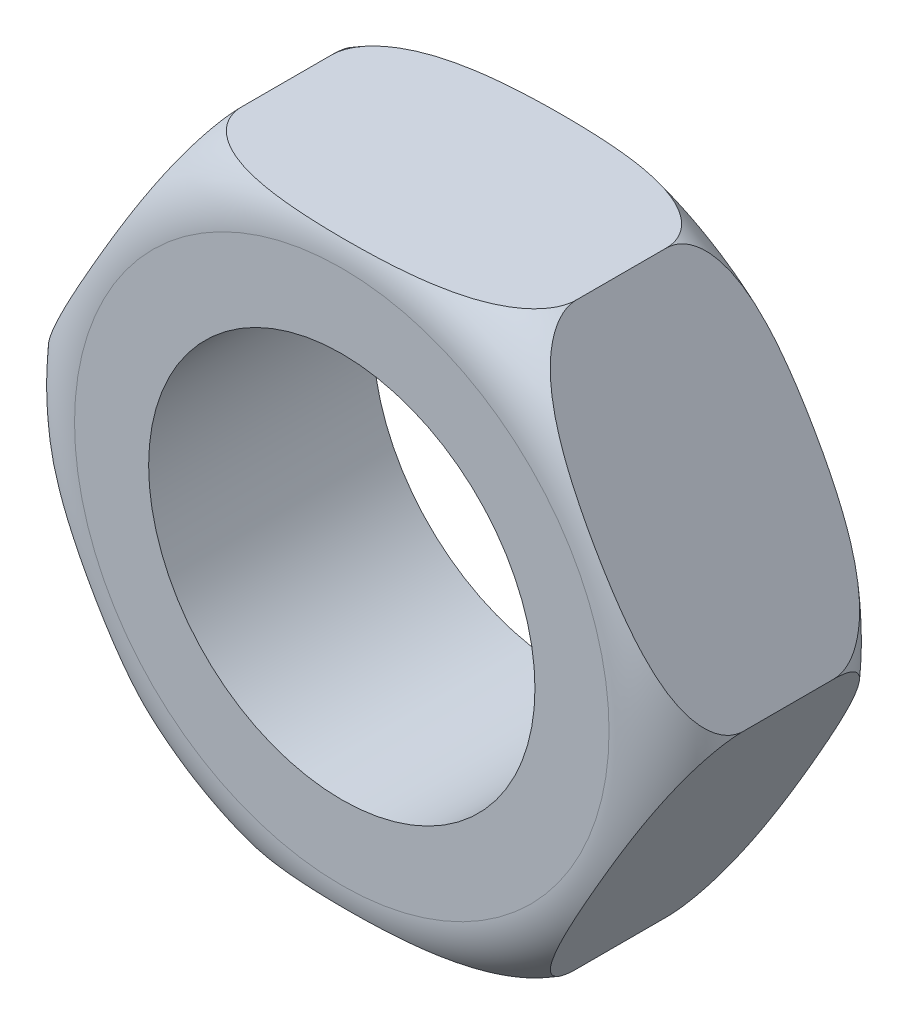
ISO-10303-21;
HEADER;
FILE_DESCRIPTION(('STEP AP214'),'2;1');
FILE_NAME('part.step','',(''),(''),'','','');
FILE_SCHEMA(('AUTOMOTIVE_DESIGN { 1 0 10303 214 1 1 1 1 }'));
ENDSEC;
DATA;
#1=APPLICATION_CONTEXT('core data for automotive mechanical design processes');
#2=APPLICATION_PROTOCOL_DEFINITION('international standard','automotive_design',2000,#1);
#3=PRODUCT_CONTEXT('',#1,'mechanical');
#4=PRODUCT('Part','Part','',(#3));
#5=PRODUCT_RELATED_PRODUCT_CATEGORY('part','',(#4));
#6=PRODUCT_DEFINITION_FORMATION('','',#4);
#7=PRODUCT_DEFINITION_CONTEXT('part definition',#1,'design');
#8=PRODUCT_DEFINITION('design','',#6,#7);
#9=PRODUCT_DEFINITION_SHAPE('','',#8);
#10=(LENGTH_UNIT() NAMED_UNIT(*) SI_UNIT(.MILLI.,.METRE.));
#11=(NAMED_UNIT(*) PLANE_ANGLE_UNIT() SI_UNIT($,.RADIAN.));
#12=(NAMED_UNIT(*) SI_UNIT($,.STERADIAN.) SOLID_ANGLE_UNIT());
#13=UNCERTAINTY_MEASURE_WITH_UNIT(LENGTH_MEASURE(1.E-05),#10,'distance_accuracy_value','');
#14=(GEOMETRIC_REPRESENTATION_CONTEXT(3) GLOBAL_UNCERTAINTY_ASSIGNED_CONTEXT((#13)) GLOBAL_UNIT_ASSIGNED_CONTEXT((#10,
#11,#12)) REPRESENTATION_CONTEXT('',''));
#15=CARTESIAN_POINT('',(0.,0.,0.));
#16=DIRECTION('',(0.,0.,1.));
#17=DIRECTION('',(1.,0.,0.));
#18=AXIS2_PLACEMENT_3D('',#15,#16,#17);
#19=CARTESIAN_POINT('',(-6.87407664253898,-11.90625,-90.2989));
#20=DIRECTION('',(0.,1.,0.));
#21=DIRECTION('',(1.,0.,0.));
#22=AXIS2_PLACEMENT_3D('',#19,#20,#21);
#23=PLANE('',#22);
#24=DIRECTION('',(0.,0.,-1.));
#25=VECTOR('',#24,1.);
#26=CARTESIAN_POINT('',(6.874076642539,-11.90625,-90.2989));
#27=LINE('',#26,#25);
#28=CARTESIAN_POINT('',(6.87407664253901,-11.90625,-93.06496));
#29=VERTEX_POINT('',#28);
#30=CARTESIAN_POINT('',(6.874076642539,-11.90625,-96.75304));
#31=VERTEX_POINT('',#30);
#32=EDGE_CURVE('E90',#29,#31,#27,.T.);
#33=ORIENTED_EDGE('',*,*,#32,.F.);
#34=CARTESIAN_POINT('',(6.87407664253902,-11.90625,-93.06496));
#35=CARTESIAN_POINT('',(6.87407664253902,-11.90625,-92.5761053863462));
#36=CARTESIAN_POINT('',(6.54380387878346,-11.90625,-92.1318942755352));
#37=CARTESIAN_POINT('',(6.27092783932574,-11.90625,-91.7648807585171));
#38=CARTESIAN_POINT('',(5.79655615993552,-11.90625,-91.4704397051228));
#39=CARTESIAN_POINT('',(5.07488756456218,-11.90625,-91.0225022108432));
#40=CARTESIAN_POINT('',(3.93169877939446,-11.90625,-90.7784110832678));
#41=CARTESIAN_POINT('',(2.42435365309554,-11.90625,-90.4565661034209));
#42=CARTESIAN_POINT('',(-0.0182857169352697,-11.90625,-90.4578550277632));
#43=CARTESIAN_POINT('',(-2.4549186549817,-11.90625,-90.4591407826502));
#44=CARTESIAN_POINT('',(-3.95635400238736,-11.90625,-90.7837080217361));
#45=CARTESIAN_POINT('',(-5.0860129627235,-11.90625,-91.0279078738966));
#46=CARTESIAN_POINT('',(-5.80218815013209,-11.90625,-91.4739413587718));
#47=CARTESIAN_POINT('',(-6.27164365050244,-11.90625,-91.7663179678829));
#48=CARTESIAN_POINT('',(-6.54373366839595,-11.90625,-92.1317999062995));
#49=CARTESIAN_POINT('',(-6.87407664253898,-11.90625,-92.5755294905997));
#50=CARTESIAN_POINT('',(-6.87407664253898,-11.90625,-93.06496));
#51=B_SPLINE_CURVE_WITH_KNOTS('',2,(#34,#35,#36,#37,#38,#39,#40,#41,#42,#43,#44,#45,#46,#47,#48,
#49,#50),.UNSPECIFIED.,.F.,.F.,(3,2,2,2,2,2,2,2,3),(0.,0.0625,0.125,0.25,0.5,0.75,0.875,0.9375,
1.),.UNSPECIFIED.);
#52=CARTESIAN_POINT('',(-6.87407664253898,-11.90625,-93.06496));
#53=VERTEX_POINT('',#52);
#54=EDGE_CURVE('E255',#29,#53,#51,.T.);
#55=ORIENTED_EDGE('',*,*,#54,.T.);
#56=DIRECTION('',(0.,0.,-1.));
#57=VECTOR('',#56,1.);
#58=CARTESIAN_POINT('',(-6.87407664253898,-11.90625,-90.2989));
#59=LINE('',#58,#57);
#60=CARTESIAN_POINT('',(-6.874076642539,-11.90625,-96.75304));
#61=VERTEX_POINT('',#60);
#62=EDGE_CURVE('E11',#53,#61,#59,.T.);
#63=ORIENTED_EDGE('',*,*,#62,.T.);
#64=CARTESIAN_POINT('',(-6.87407664253901,-11.90625,-96.75304));
#65=CARTESIAN_POINT('',(-6.87407664253901,-11.90625,-97.2418946136181));
#66=CARTESIAN_POINT('',(-6.54380387878346,-11.90625,-97.6861057244648));
#67=CARTESIAN_POINT('',(-6.27092783935708,-11.90625,-98.0531192414704));
#68=CARTESIAN_POINT('',(-5.79655615993552,-11.90625,-98.3475602948772));
#69=CARTESIAN_POINT('',(-5.07488756462839,-11.90625,-98.7954977891051));
#70=CARTESIAN_POINT('',(-3.93169877939448,-11.90625,-99.0395889167322));
#71=CARTESIAN_POINT('',(-2.42435365332761,-11.90625,-99.3614338965792));
#72=CARTESIAN_POINT('',(0.0182857169351404,-11.90625,-99.3601449722368));
#73=CARTESIAN_POINT('',(2.45491865515262,-11.90625,-99.3588592173497));
#74=CARTESIAN_POINT('',(3.95635400238732,-11.90625,-99.0342919782639));
#75=CARTESIAN_POINT('',(5.08601296274402,-11.90625,-98.7900921260712));
#76=CARTESIAN_POINT('',(5.80218815013206,-11.90625,-98.3440586412283));
#77=CARTESIAN_POINT('',(6.27164365049224,-11.90625,-98.0516820321363));
#78=CARTESIAN_POINT('',(6.54373366839594,-11.90625,-97.6862000937005));
#79=CARTESIAN_POINT('',(6.874076642539,-11.90625,-97.2424705093936));
#80=CARTESIAN_POINT('',(6.874076642539,-11.90625,-96.75304));
#81=B_SPLINE_CURVE_WITH_KNOTS('',2,(#64,#65,#66,#67,#68,#69,#70,#71,#72,#73,#74,#75,#76,#77,#78,
#79,#80),.UNSPECIFIED.,.F.,.F.,(3,2,2,2,2,2,2,2,3),(0.,0.0625,0.125,0.25,0.5,0.75,0.875,0.9375,
1.),.UNSPECIFIED.);
#82=EDGE_CURVE('E403',#61,#31,#81,.T.);
#83=ORIENTED_EDGE('',*,*,#82,.T.);
#84=EDGE_LOOP('',(#33,#55,#63,#83));
#85=FACE_BOUND('',#84,.T.);
#86=ADVANCED_FACE('F17',(#85),#23,.F.);
#87=CARTESIAN_POINT('',(-13.748153285078,0.,-90.2989));
#88=DIRECTION('',(0.866025403784439,0.5,0.));
#89=DIRECTION('',(0.,0.,-1.));
#90=AXIS2_PLACEMENT_3D('',#87,#88,#89);
#91=PLANE('',#90);
#92=ORIENTED_EDGE('',*,*,#62,.F.);
#93=CARTESIAN_POINT('',(-6.87407664253898,-11.90625,-93.06496));
#94=CARTESIAN_POINT('',(-6.87407664253898,-11.90625,-92.5760058480893));
#95=CARTESIAN_POINT('',(-7.03927004143693,-11.6201266400338,-92.1317410091233));
#96=CARTESIAN_POINT('',(-7.17568813046454,-11.3838435787665,-91.7648633932002));
#97=CARTESIAN_POINT('',(-7.41276338560254,-10.9732171916501,-91.4705309181294));
#98=CARTESIAN_POINT('',(-7.77293234532155,-10.3493862541076,-91.0233757677697));
#99=CARTESIAN_POINT('',(-8.34306670156636,-9.36188458195097,-90.7793508882997));
#100=CARTESIAN_POINT('',(-9.09532815061541,-8.05892953162263,-90.4573732571968));
#101=CARTESIAN_POINT('',(-10.3146535980907,-5.9469959056338,-90.4578507959048));
#102=CARTESIAN_POINT('',(-11.5374262048112,-3.8290916246905,-90.4583296846642));
#103=CARTESIAN_POINT('',(-12.2902049825038,-2.52524053486718,-90.7841030566513));
#104=CARTESIAN_POINT('',(-12.8572751999037,-1.54304610687141,-91.029508987783));
#105=CARTESIAN_POINT('',(-13.2158049185761,-0.922054418107435,-91.4784336156656));
#106=CARTESIAN_POINT('',(-13.4498057631221,-0.516753066339889,-91.7714323172822));
#107=CARTESIAN_POINT('',(-13.5850275278136,-0.282542099605026,-92.1373185894382));
#108=CARTESIAN_POINT('',(-13.748153285078,0.,-92.5787081494267));
#109=CARTESIAN_POINT('',(-13.748153285078,0.,-93.06496));
#110=B_SPLINE_CURVE_WITH_KNOTS('',2,(#93,#94,#95,#96,#97,#98,#99,#100,#101,#102,#103,#104,#105,
#106,#107,#108,#109),.UNSPECIFIED.,.F.,.F.,(3,2,2,2,2,2,2,2,3),(0.,0.0625,0.125,0.25,0.5,0.75,
0.875,0.9375,1.),.UNSPECIFIED.);
#111=CARTESIAN_POINT('',(-13.748153285078,0.,-93.06496));
#112=VERTEX_POINT('',#111);
#113=EDGE_CURVE('E273',#53,#112,#110,.T.);
#114=ORIENTED_EDGE('',*,*,#113,.T.);
#115=DIRECTION('',(0.,0.,-1.));
#116=VECTOR('',#115,1.);
#117=CARTESIAN_POINT('',(-13.748153285078,0.,-90.2989));
#118=LINE('',#117,#116);
#119=CARTESIAN_POINT('',(-13.748153285078,0.,-96.75304));
#120=VERTEX_POINT('',#119);
#121=EDGE_CURVE('E30',#112,#120,#118,.T.);
#122=ORIENTED_EDGE('',*,*,#121,.T.);
#123=CARTESIAN_POINT('',(-13.748153285078,0.,-96.75304));
#124=CARTESIAN_POINT('',(-13.748153285078,0.,-97.2419941518704));
#125=CARTESIAN_POINT('',(-13.58295988618,-0.286123359966257,-97.6862589908768));
#126=CARTESIAN_POINT('',(-13.4465417971845,-0.522406421177844,-98.0531366067466));
#127=CARTESIAN_POINT('',(-13.2094665420144,-0.933032808349879,-98.3474690818706));
#128=CARTESIAN_POINT('',(-12.8492975823377,-1.55686374581912,-98.7946242321979));
#129=CARTESIAN_POINT('',(-12.2791632260506,-2.54436541804904,-99.0386491117003));
#130=CARTESIAN_POINT('',(-11.5269017771174,-3.8473204681766,-99.3606267427725));
#131=CARTESIAN_POINT('',(-10.3075763295263,-5.9592540943662,-99.3601492040952));
#132=CARTESIAN_POINT('',(-9.0848037228409,-8.07715837524866,-99.3596703153667));
#133=CARTESIAN_POINT('',(-8.33202494511309,-9.38100946513283,-99.0338969433487));
#134=CARTESIAN_POINT('',(-7.76495472769155,-10.3632038931661,-98.7884910121958));
#135=CARTESIAN_POINT('',(-7.40642500904078,-10.9841955818926,-98.3395663843344));
#136=CARTESIAN_POINT('',(-7.1724241644873,-11.3894969336732,-98.0465676827044));
#137=CARTESIAN_POINT('',(-7.03720239980334,-11.623707900395,-97.6806814105619));
#138=CARTESIAN_POINT('',(-6.87407664253899,-11.90625,-97.2392918505647));
#139=CARTESIAN_POINT('',(-6.87407664253899,-11.90625,-96.75304));
#140=B_SPLINE_CURVE_WITH_KNOTS('',2,(#123,#124,#125,#126,#127,#128,#129,#130,#131,#132,#133,
#134,#135,#136,#137,#138,#139),.UNSPECIFIED.,.F.,.F.,(3,2,2,2,2,2,2,2,3),(0.,0.0625,0.125,0.25,
0.5,0.75,0.875,0.9375,1.),.UNSPECIFIED.);
#141=EDGE_CURVE('E137',#120,#61,#140,.T.);
#142=ORIENTED_EDGE('',*,*,#141,.T.);
#143=EDGE_LOOP('',(#92,#114,#122,#142));
#144=FACE_BOUND('',#143,.T.);
#145=ADVANCED_FACE('F318',(#144),#91,.F.);
#146=CARTESIAN_POINT('',(-6.87407664253898,11.90625,-90.2989));
#147=DIRECTION('',(0.866025403784439,-0.5,0.));
#148=DIRECTION('',(0.,0.,-1.));
#149=AXIS2_PLACEMENT_3D('',#146,#147,#148);
#150=PLANE('',#149);
#151=ORIENTED_EDGE('',*,*,#121,.F.);
#152=CARTESIAN_POINT('',(-13.748153285078,0.,-93.06496));
#153=CARTESIAN_POINT('',(-13.748153285078,0.,-92.5760058481065));
#154=CARTESIAN_POINT('',(-13.58295988618,0.286123359966259,-92.1317410091233));
#155=CARTESIAN_POINT('',(-13.446541797161,0.522406421218553,-91.7648633932093));
#156=CARTESIAN_POINT('',(-13.2094665420144,0.933032808349887,-91.4705309181294));
#157=CARTESIAN_POINT('',(-12.8492975823086,1.55686374586965,-91.0233757677886));
#158=CARTESIAN_POINT('',(-12.2791632260506,2.54436541804903,-90.7793508882997));
#159=CARTESIAN_POINT('',(-11.5269017770422,3.84732046830688,-90.4573732571968));
#160=CARTESIAN_POINT('',(-10.3075763295263,5.95925409436619,-90.4578507959048));
#161=CARTESIAN_POINT('',(-9.08480372276762,8.07715837537559,-90.4583296846642));
#162=CARTESIAN_POINT('',(-8.3320249451131,9.38100946513281,-90.7841030566514));
#163=CARTESIAN_POINT('',(-7.76495472767743,10.3632038931905,-91.029508987811));
#164=CARTESIAN_POINT('',(-7.4064250090408,10.9841955818926,-91.4784336156656));
#165=CARTESIAN_POINT('',(-7.17242416448657,11.3894969336745,-91.7714323173037));
#166=CARTESIAN_POINT('',(-7.03720239980335,11.623707900395,-92.1373185894382));
#167=CARTESIAN_POINT('',(-6.87407664253898,11.90625,-92.578708149428));
#168=CARTESIAN_POINT('',(-6.87407664253898,11.90625,-93.06496));
#169=B_SPLINE_CURVE_WITH_KNOTS('',2,(#152,#153,#154,#155,#156,#157,#158,#159,#160,#161,#162,
#163,#164,#165,#166,#167,#168),.UNSPECIFIED.,.F.,.F.,(3,2,2,2,2,2,2,2,3),(0.,0.0625,0.125,0.25,
0.5,0.75,0.875,0.9375,1.),.UNSPECIFIED.);
#170=CARTESIAN_POINT('',(-6.87407664253897,11.90625,-93.06496));
#171=VERTEX_POINT('',#170);
#172=EDGE_CURVE('E115',#112,#171,#169,.T.);
#173=ORIENTED_EDGE('',*,*,#172,.T.);
#174=DIRECTION('',(0.,0.,-1.));
#175=VECTOR('',#174,1.);
#176=CARTESIAN_POINT('',(-6.87407664253898,11.90625,-90.2989));
#177=LINE('',#176,#175);
#178=CARTESIAN_POINT('',(-6.87407664253897,11.90625,-96.75304));
#179=VERTEX_POINT('',#178);
#180=EDGE_CURVE('E106',#171,#179,#177,.T.);
#181=ORIENTED_EDGE('',*,*,#180,.T.);
#182=CARTESIAN_POINT('',(-6.87407664253898,11.90625,-96.75304));
#183=CARTESIAN_POINT('',(-6.87407664253898,11.90625,-97.2419941518779));
#184=CARTESIAN_POINT('',(-7.03927004143694,11.6201266400337,-97.6862589908768));
#185=CARTESIAN_POINT('',(-7.1756881304327,11.3838435788216,-98.0531366067412));
#186=CARTESIAN_POINT('',(-7.41276338560254,10.9732171916501,-98.3474690818706));
#187=CARTESIAN_POINT('',(-7.77293234528718,10.3493862541671,-98.7946242322165));
#188=CARTESIAN_POINT('',(-8.34306670156637,9.36188458195096,-99.0386491117003));
#189=CARTESIAN_POINT('',(-9.09532815061848,8.05892953161732,-99.3606267428032));
#190=CARTESIAN_POINT('',(-10.3146535980907,5.9469959056338,-99.3601492040952));
#191=CARTESIAN_POINT('',(-11.5374262050306,3.82909162431034,-99.3596703153357));
#192=CARTESIAN_POINT('',(-12.2902049825038,2.52524053486718,-99.0338969433486));
#193=CARTESIAN_POINT('',(-12.8572751999862,1.54304610672853,-98.7884910121097));
#194=CARTESIAN_POINT('',(-13.2158049185761,0.92205441810745,-98.3395663843344));
#195=CARTESIAN_POINT('',(-13.4498057631219,0.516753066340114,-98.0465676827205));
#196=CARTESIAN_POINT('',(-13.5850275278136,0.282542099605036,-97.6806814105619));
#197=CARTESIAN_POINT('',(-13.748153285078,0.,-97.2392918505704));
#198=CARTESIAN_POINT('',(-13.748153285078,0.,-96.75304));
#199=B_SPLINE_CURVE_WITH_KNOTS('',2,(#182,#183,#184,#185,#186,#187,#188,#189,#190,#191,#192,
#193,#194,#195,#196,#197,#198),.UNSPECIFIED.,.F.,.F.,(3,2,2,2,2,2,2,2,3),(0.,0.0625,0.125,0.25,
0.5,0.75,0.875,0.9375,1.),.UNSPECIFIED.);
#200=EDGE_CURVE('E111',#179,#120,#199,.T.);
#201=ORIENTED_EDGE('',*,*,#200,.T.);
#202=EDGE_LOOP('',(#151,#173,#181,#201));
#203=FACE_BOUND('',#202,.T.);
#204=ADVANCED_FACE('F109',(#203),#150,.F.);
#205=CARTESIAN_POINT('',(6.87407664253898,11.90625,-90.2989));
#206=DIRECTION('',(0.,-1.,0.));
#207=DIRECTION('',(0.,0.,-1.));
#208=AXIS2_PLACEMENT_3D('',#205,#206,#207);
#209=PLANE('',#208);
#210=ORIENTED_EDGE('',*,*,#180,.F.);
#211=CARTESIAN_POINT('',(-6.87407664253896,11.90625,-93.06496));
#212=CARTESIAN_POINT('',(-6.87407664253896,11.90625,-92.5761053863759));
#213=CARTESIAN_POINT('',(-6.54380387878342,11.90625,-92.1318942755352));
#214=CARTESIAN_POINT('',(-6.27092783935964,11.90625,-91.7648807585382));
#215=CARTESIAN_POINT('',(-5.79655615993548,11.90625,-91.4704397051229));
#216=CARTESIAN_POINT('',(-5.07488756461912,11.90625,-91.0225022108786));
#217=CARTESIAN_POINT('',(-3.93169877939446,11.90625,-90.7784110832678));
#218=CARTESIAN_POINT('',(-2.42435365337837,11.90625,-90.4565661034505));
#219=CARTESIAN_POINT('',(0.0182857169351101,11.90625,-90.4578550277633));
#220=CARTESIAN_POINT('',(2.454918654864,11.90625,-90.4591407826205));
#221=CARTESIAN_POINT('',(3.95635400238727,11.90625,-90.7837080217361));
#222=CARTESIAN_POINT('',(5.08601296273467,11.90625,-91.0279078739022));
#223=CARTESIAN_POINT('',(5.80218815013203,11.90625,-91.4739413587718));
#224=CARTESIAN_POINT('',(6.2716436505248,11.90625,-91.7663179678977));
#225=CARTESIAN_POINT('',(6.54373366839592,11.90625,-92.1317999062996));
#226=CARTESIAN_POINT('',(6.87407664253899,11.90625,-92.5755294906184));
#227=CARTESIAN_POINT('',(6.87407664253899,11.90625,-93.06496));
#228=B_SPLINE_CURVE_WITH_KNOTS('',2,(#211,#212,#213,#214,#215,#216,#217,#218,#219,#220,#221,
#222,#223,#224,#225,#226,#227),.UNSPECIFIED.,.F.,.F.,(3,2,2,2,2,2,2,2,3),(0.,0.0625,0.125,0.25,
0.5,0.75,0.875,0.9375,1.),.UNSPECIFIED.);
#229=CARTESIAN_POINT('',(6.87407664253898,11.90625,-93.06496));
#230=VERTEX_POINT('',#229);
#231=EDGE_CURVE('E263',#171,#230,#228,.T.);
#232=ORIENTED_EDGE('',*,*,#231,.T.);
#233=DIRECTION('',(0.,0.,-1.));
#234=VECTOR('',#233,1.);
#235=CARTESIAN_POINT('',(6.87407664253898,11.90625,-90.2989));
#236=LINE('',#235,#234);
#237=CARTESIAN_POINT('',(6.87407664253898,11.90625,-96.75304));
#238=VERTEX_POINT('',#237);
#239=EDGE_CURVE('E73',#230,#238,#236,.T.);
#240=ORIENTED_EDGE('',*,*,#239,.T.);
#241=CARTESIAN_POINT('',(6.87407664253899,11.90625,-96.75304));
#242=CARTESIAN_POINT('',(6.87407664253899,11.90625,-97.2418946136324));
#243=CARTESIAN_POINT('',(6.54380387878344,11.90625,-97.6861057244648));
#244=CARTESIAN_POINT('',(6.27092783934875,11.90625,-98.0531192414697));
#245=CARTESIAN_POINT('',(5.7965561599355,11.90625,-98.3475602948772));
#246=CARTESIAN_POINT('',(5.0748875646504,11.90625,-98.7954977891004));
#247=CARTESIAN_POINT('',(3.93169877939448,11.90625,-99.0395889167322));
#248=CARTESIAN_POINT('',(2.42435365332747,11.90625,-99.3614338965792));
#249=CARTESIAN_POINT('',(-0.0182857169350702,11.90625,-99.3601449722368));
#250=CARTESIAN_POINT('',(-2.45491865481299,11.90625,-99.3588592173499));
#251=CARTESIAN_POINT('',(-3.95635400238724,11.90625,-99.0342919782639));
#252=CARTESIAN_POINT('',(-5.08601296253178,11.90625,-98.7900921261723));
#253=CARTESIAN_POINT('',(-5.80218815013202,11.90625,-98.3440586412283));
#254=CARTESIAN_POINT('',(-6.27164365043988,11.90625,-98.0516820321893));
#255=CARTESIAN_POINT('',(-6.54373366839592,11.90625,-97.6862000937005));
#256=CARTESIAN_POINT('',(-6.87407664253896,11.90625,-97.2424705094146));
#257=CARTESIAN_POINT('',(-6.87407664253896,11.90625,-96.75304));
#258=B_SPLINE_CURVE_WITH_KNOTS('',2,(#241,#242,#243,#244,#245,#246,#247,#248,#249,#250,#251,
#252,#253,#254,#255,#256,#257),.UNSPECIFIED.,.F.,.F.,(3,2,2,2,2,2,2,2,3),(0.,0.0625,0.125,0.25,
0.5,0.75,0.875,0.9375,1.),.UNSPECIFIED.);
#259=EDGE_CURVE('E122',#238,#179,#258,.T.);
#260=ORIENTED_EDGE('',*,*,#259,.T.);
#261=EDGE_LOOP('',(#210,#232,#240,#260));
#262=FACE_BOUND('',#261,.T.);
#263=ADVANCED_FACE('F124',(#262),#209,.F.);
#264=CARTESIAN_POINT('',(13.748153285078,0.,-90.2989));
#265=DIRECTION('',(-0.866025403784438,-0.5,0.));
#266=DIRECTION('',(-0.5,0.866025403784438,0.));
#267=AXIS2_PLACEMENT_3D('',#264,#265,#266);
#268=PLANE('',#267);
#269=ORIENTED_EDGE('',*,*,#239,.F.);
#270=CARTESIAN_POINT('',(6.87407664253899,11.90625,-93.06496));
#271=CARTESIAN_POINT('',(6.87407664253899,11.90625,-92.5760058481031));
#272=CARTESIAN_POINT('',(7.03927004143695,11.6201266400337,-92.1317410091233));
#273=CARTESIAN_POINT('',(7.17568813046118,11.3838435787723,-91.764863393198));
#274=CARTESIAN_POINT('',(7.41276338560255,10.9732171916501,-91.4705309181294));
#275=CARTESIAN_POINT('',(7.77293234534987,10.3493862540585,-91.0233757677444));
#276=CARTESIAN_POINT('',(8.34306670156638,9.36188458195096,-90.7793508882997));
#277=CARTESIAN_POINT('',(9.09532815058417,8.05892953167676,-90.4573732572276));
#278=CARTESIAN_POINT('',(10.3146535980907,5.94699590563381,-90.4578507959048));
#279=CARTESIAN_POINT('',(11.5374262046972,3.82909162488793,-90.4583296846333));
#280=CARTESIAN_POINT('',(12.2902049825038,2.52524053486719,-90.7841030566513));
#281=CARTESIAN_POINT('',(12.8572751999381,1.54304610681196,-91.029508987784));
#282=CARTESIAN_POINT('',(13.2158049185762,0.922054418107446,-91.4784336156657));
#283=CARTESIAN_POINT('',(13.4498057631478,0.516753066295346,-91.7714323173419));
#284=CARTESIAN_POINT('',(13.5850275278136,0.282542099605034,-92.1373185894382));
#285=CARTESIAN_POINT('',(13.748153285078,0.,-92.5787081494387));
#286=CARTESIAN_POINT('',(13.748153285078,0.,-93.06496));
#287=B_SPLINE_CURVE_WITH_KNOTS('',2,(#270,#271,#272,#273,#274,#275,#276,#277,#278,#279,#280,
#281,#282,#283,#284,#285,#286),.UNSPECIFIED.,.F.,.F.,(3,2,2,2,2,2,2,2,3),(0.,0.0625,0.125,0.25,
0.5,0.75,0.875,0.9375,1.),.UNSPECIFIED.);
#288=CARTESIAN_POINT('',(13.748153285078,0.,-93.06496));
#289=VERTEX_POINT('',#288);
#290=EDGE_CURVE('E234',#230,#289,#287,.T.);
#291=ORIENTED_EDGE('',*,*,#290,.T.);
#292=DIRECTION('',(0.,0.,-1.));
#293=VECTOR('',#292,1.);
#294=CARTESIAN_POINT('',(13.748153285078,0.,-90.2989));
#295=LINE('',#294,#293);
#296=CARTESIAN_POINT('',(13.748153285078,0.,-96.75304));
#297=VERTEX_POINT('',#296);
#298=EDGE_CURVE('E189',#289,#297,#295,.T.);
#299=ORIENTED_EDGE('',*,*,#298,.T.);
#300=CARTESIAN_POINT('',(13.748153285078,0.,-96.75304));
#301=CARTESIAN_POINT('',(13.748153285078,0.,-97.2419941518828));
#302=CARTESIAN_POINT('',(13.58295988618,0.286123359966266,-97.6862589908767));
#303=CARTESIAN_POINT('',(13.4465417971732,0.522406421197435,-98.0531366067668));
#304=CARTESIAN_POINT('',(13.2094665420144,0.933032808349892,-98.3474690818706));
#305=CARTESIAN_POINT('',(12.8492975822717,1.55686374593351,-98.7946242322705));
#306=CARTESIAN_POINT('',(12.2791632260506,2.54436541804905,-99.0386491117002));
#307=CARTESIAN_POINT('',(11.5269017768366,3.84732046866301,-99.360626742834));
#308=CARTESIAN_POINT('',(10.3075763295263,5.9592540943662,-99.3601492040952));
#309=CARTESIAN_POINT('',(9.08480372273678,8.07715837542904,-99.3596703153049));
#310=CARTESIAN_POINT('',(8.33202494511311,9.38100946513282,-99.0338969433487));
#311=CARTESIAN_POINT('',(7.76495472774099,10.3632038930805,-98.7884910122298));
#312=CARTESIAN_POINT('',(7.4064250090408,10.9841955818926,-98.3395663843344));
#313=CARTESIAN_POINT('',(7.17242416450441,11.3894969336436,-98.0465676827441));
#314=CARTESIAN_POINT('',(7.03720239980336,11.623707900395,-97.6806814105618));
#315=CARTESIAN_POINT('',(6.87407664253899,11.90625,-97.2392918505726));
#316=CARTESIAN_POINT('',(6.87407664253899,11.90625,-96.75304));
#317=B_SPLINE_CURVE_WITH_KNOTS('',2,(#300,#301,#302,#303,#304,#305,#306,#307,#308,#309,#310,
#311,#312,#313,#314,#315,#316),.UNSPECIFIED.,.F.,.F.,(3,2,2,2,2,2,2,2,3),(0.,0.0625,0.125,0.25,
0.5,0.75,0.875,0.9375,1.),.UNSPECIFIED.);
#318=EDGE_CURVE('E201',#297,#238,#317,.T.);
#319=ORIENTED_EDGE('',*,*,#318,.T.);
#320=EDGE_LOOP('',(#269,#291,#299,#319));
#321=FACE_BOUND('',#320,.T.);
#322=ADVANCED_FACE('F206',(#321),#268,.F.);
#323=CARTESIAN_POINT('',(6.874076642539,-11.90625,-90.2989));
#324=DIRECTION('',(-0.866025403784439,0.5,0.));
#325=DIRECTION('',(0.,0.,1.));
#326=AXIS2_PLACEMENT_3D('',#323,#324,#325);
#327=PLANE('',#326);
#328=ORIENTED_EDGE('',*,*,#298,.F.);
#329=CARTESIAN_POINT('',(13.748153285078,0.,-93.06496));
#330=CARTESIAN_POINT('',(13.748153285078,0.,-92.576005848111));
#331=CARTESIAN_POINT('',(13.58295988618,-0.286123359966277,-92.1317410091233));
#332=CARTESIAN_POINT('',(13.4465417971622,-0.522406421216646,-91.7648633932086));
#333=CARTESIAN_POINT('',(13.2094665420144,-0.933032808349905,-91.4705309181294));
#334=CARTESIAN_POINT('',(12.8492975822481,-1.5568637459744,-91.0233757677168));
#335=CARTESIAN_POINT('',(12.2791632260506,-2.54436541804906,-90.7793508882998));
#336=CARTESIAN_POINT('',(11.5269017769007,-3.84732046855198,-90.4573732571968));
#337=CARTESIAN_POINT('',(10.3075763295263,-5.9592540943662,-90.4578507959048));
#338=CARTESIAN_POINT('',(9.08480372277611,-8.07715837536093,-90.4583296846642));
#339=CARTESIAN_POINT('',(8.33202494511312,-9.38100946513283,-90.7841030566514));
#340=CARTESIAN_POINT('',(7.76495472769957,-10.3632038931522,-91.0295089877986));
#341=CARTESIAN_POINT('',(7.40642500904081,-10.9841955818926,-91.4784336156656));
#342=CARTESIAN_POINT('',(7.1724241644965,-11.3894969336573,-91.7714323172812));
#343=CARTESIAN_POINT('',(7.03720239980336,-11.623707900395,-92.1373185894382));
#344=CARTESIAN_POINT('',(6.874076642539,-11.90625,-92.5787081494227));
#345=CARTESIAN_POINT('',(6.874076642539,-11.90625,-93.06496));
#346=B_SPLINE_CURVE_WITH_KNOTS('',2,(#329,#330,#331,#332,#333,#334,#335,#336,#337,#338,#339,
#340,#341,#342,#343,#344,#345),.UNSPECIFIED.,.F.,.F.,(3,2,2,2,2,2,2,2,3),(0.,0.0625,0.125,0.25,
0.5,0.75,0.875,0.9375,1.),.UNSPECIFIED.);
#347=EDGE_CURVE('E246',#289,#29,#346,.T.);
#348=ORIENTED_EDGE('',*,*,#347,.T.);
#349=ORIENTED_EDGE('',*,*,#32,.T.);
#350=CARTESIAN_POINT('',(6.874076642539,-11.90625,-96.75304));
#351=CARTESIAN_POINT('',(6.874076642539,-11.90625,-97.2419941518942));
#352=CARTESIAN_POINT('',(7.03927004143696,-11.6201266400337,-97.6862589908767));
#353=CARTESIAN_POINT('',(7.17568813046629,-11.3838435787635,-98.053136606818));
#354=CARTESIAN_POINT('',(7.41276338560256,-10.9732171916501,-98.3474690818706));
#355=CARTESIAN_POINT('',(7.77293234542599,-10.3493862539267,-98.7946242323354));
#356=CARTESIAN_POINT('',(8.34306670156638,-9.36188458195096,-99.0386491117002));
#357=CARTESIAN_POINT('',(9.09532815080188,-8.0589295312997,-99.3606267428031));
#358=CARTESIAN_POINT('',(10.3146535980907,-5.94699590563382,-99.3601492040952));
#359=CARTESIAN_POINT('',(11.5374262048028,-3.8290916247051,-99.3596703153358));
#360=CARTESIAN_POINT('',(12.2902049825038,-2.5252405348672,-99.0338969433487));
#361=CARTESIAN_POINT('',(12.8572751998784,-1.54304610691538,-98.7884910122308));
#362=CARTESIAN_POINT('',(13.2158049185762,-0.922054418107467,-98.3395663843344));
#363=CARTESIAN_POINT('',(13.4498057631156,-0.516753066351077,-98.0465676827376));
#364=CARTESIAN_POINT('',(13.5850275278136,-0.282542099605054,-97.6806814105619));
#365=CARTESIAN_POINT('',(13.748153285078,0.,-97.2392918505704));
#366=CARTESIAN_POINT('',(13.748153285078,0.,-96.75304));
#367=B_SPLINE_CURVE_WITH_KNOTS('',2,(#350,#351,#352,#353,#354,#355,#356,#357,#358,#359,#360,
#361,#362,#363,#364,#365,#366),.UNSPECIFIED.,.F.,.F.,(3,2,2,2,2,2,2,2,3),(0.,0.0625,0.125,0.25,
0.5,0.75,0.875,0.9375,1.),.UNSPECIFIED.);
#368=EDGE_CURVE('E401',#31,#297,#367,.T.);
#369=ORIENTED_EDGE('',*,*,#368,.T.);
#370=EDGE_LOOP('',(#328,#348,#349,#369));
#371=FACE_BOUND('',#370,.T.);
#372=ADVANCED_FACE('F160',(#371),#327,.F.);
#373=CARTESIAN_POINT('',(13.748153285078,0.,-99.5191));
#374=DIRECTION('',(0.,0.,1.));
#375=DIRECTION('',(1.,0.,0.));
#376=AXIS2_PLACEMENT_3D('',#373,#374,#375);
#377=PLANE('',#376);
#378=CARTESIAN_POINT('',(0.,0.,-99.5191));
#379=DIRECTION('',(0.,0.,1.));
#380=DIRECTION('',(1.,0.,0.));
#381=AXIS2_PLACEMENT_3D('',#378,#379,#380);
#382=CIRCLE('',#381,7.9375);
#383=CARTESIAN_POINT('',(-7.9375,0.,-99.5191));
#384=VERTEX_POINT('',#383);
#385=EDGE_CURVE('E43',#384,#384,#382,.T.);
#386=ORIENTED_EDGE('',*,*,#385,.T.);
#387=EDGE_LOOP('',(#386));
#388=FACE_BOUND('',#387,.T.);
#389=CARTESIAN_POINT('',(0.,0.,-99.5191));
#390=DIRECTION('',(0.,0.,1.));
#391=DIRECTION('',(1.,0.,0.));
#392=AXIS2_PLACEMENT_3D('',#389,#390,#391);
#393=CIRCLE('',#392,10.982093285078);
#394=CARTESIAN_POINT('',(-10.982093285078,0.,-99.5191));
#395=VERTEX_POINT('',#394);
#396=EDGE_CURVE('E291',#395,#395,#393,.T.);
#397=ORIENTED_EDGE('',*,*,#396,.F.);
#398=EDGE_LOOP('',(#397));
#399=FACE_BOUND('',#398,.T.);
#400=ADVANCED_FACE('F310',(#388,#399),#377,.F.);
#401=CARTESIAN_POINT('',(13.748153285078,0.,-90.2989));
#402=DIRECTION('',(0.,0.,1.));
#403=DIRECTION('',(1.,0.,0.));
#404=AXIS2_PLACEMENT_3D('',#401,#402,#403);
#405=PLANE('',#404);
#406=CARTESIAN_POINT('',(0.,0.,-90.2989));
#407=DIRECTION('',(0.,0.,1.));
#408=DIRECTION('',(1.,0.,0.));
#409=AXIS2_PLACEMENT_3D('',#406,#407,#408);
#410=CIRCLE('',#409,7.9375);
#411=CARTESIAN_POINT('',(7.9375,0.,-90.2989));
#412=VERTEX_POINT('',#411);
#413=EDGE_CURVE('E129',#412,#412,#410,.T.);
#414=ORIENTED_EDGE('',*,*,#413,.F.);
#415=EDGE_LOOP('',(#414));
#416=FACE_BOUND('',#415,.T.);
#417=CARTESIAN_POINT('',(0.,0.,-90.2989));
#418=DIRECTION('',(0.,0.,1.));
#419=DIRECTION('',(1.,0.,0.));
#420=AXIS2_PLACEMENT_3D('',#417,#418,#419);
#421=CIRCLE('',#420,10.982093285078);
#422=CARTESIAN_POINT('',(10.982093285078,0.,-90.2989));
#423=VERTEX_POINT('',#422);
#424=EDGE_CURVE('E285',#423,#423,#421,.T.);
#425=ORIENTED_EDGE('',*,*,#424,.T.);
#426=EDGE_LOOP('',(#425));
#427=FACE_BOUND('',#426,.T.);
#428=ADVANCED_FACE('F162',(#416,#427),#405,.T.);
#429=CARTESIAN_POINT('',(0.,0.,-90.2989));
#430=DIRECTION('',(0.,0.,-1.));
#431=DIRECTION('',(-1.,0.,0.));
#432=AXIS2_PLACEMENT_3D('',#429,#430,#431);
#433=CYLINDRICAL_SURFACE('',#432,7.9375);
#434=ORIENTED_EDGE('',*,*,#385,.F.);
#435=EDGE_LOOP('',(#434));
#436=FACE_BOUND('',#435,.T.);
#437=ORIENTED_EDGE('',*,*,#413,.T.);
#438=EDGE_LOOP('',(#437));
#439=FACE_BOUND('',#438,.T.);
#440=ADVANCED_FACE('F159',(#436,#439),#433,.F.);
#441=CARTESIAN_POINT('',(0.,0.,-96.75304));
#442=DIRECTION('',(0.,0.,1.));
#443=DIRECTION('',(1.,0.,0.));
#444=AXIS2_PLACEMENT_3D('',#441,#442,#443);
#445=TOROIDAL_SURFACE('',#444,10.982093285078,2.76606);
#446=ORIENTED_EDGE('',*,*,#318,.F.);
#447=ORIENTED_EDGE('',*,*,#368,.F.);
#448=ORIENTED_EDGE('',*,*,#82,.F.);
#449=ORIENTED_EDGE('',*,*,#141,.F.);
#450=ORIENTED_EDGE('',*,*,#200,.F.);
#451=ORIENTED_EDGE('',*,*,#259,.F.);
#452=EDGE_LOOP('',(#446,#447,#448,#449,#450,#451));
#453=FACE_BOUND('',#452,.T.);
#454=ORIENTED_EDGE('',*,*,#396,.T.);
#455=EDGE_LOOP('',(#454));
#456=FACE_BOUND('',#455,.T.);
#457=ADVANCED_FACE('F133',(#453,#456),#445,.T.);
#458=CARTESIAN_POINT('',(0.,0.,-93.06496));
#459=DIRECTION('',(0.,0.,1.));
#460=DIRECTION('',(1.,0.,0.));
#461=AXIS2_PLACEMENT_3D('',#458,#459,#460);
#462=TOROIDAL_SURFACE('',#461,10.982093285078,2.76606);
#463=ORIENTED_EDGE('',*,*,#424,.F.);
#464=EDGE_LOOP('',(#463));
#465=FACE_BOUND('',#464,.T.);
#466=ORIENTED_EDGE('',*,*,#347,.F.);
#467=ORIENTED_EDGE('',*,*,#290,.F.);
#468=ORIENTED_EDGE('',*,*,#231,.F.);
#469=ORIENTED_EDGE('',*,*,#172,.F.);
#470=ORIENTED_EDGE('',*,*,#113,.F.);
#471=ORIENTED_EDGE('',*,*,#54,.F.);
#472=EDGE_LOOP('',(#466,#467,#468,#469,#470,#471));
#473=FACE_BOUND('',#472,.T.);
#474=ADVANCED_FACE('F19',(#465,#473),#462,.T.);
#475=CLOSED_SHELL('',(#86,#145,#204,#263,#322,#372,#400,#428,#440,#457,#474));
#476=MANIFOLD_SOLID_BREP('B1',#475);
#477=ADVANCED_BREP_SHAPE_REPRESENTATION('',(#18,#476),#14);
#478=SHAPE_DEFINITION_REPRESENTATION(#9,#477);
ENDSEC;
END-ISO-10303-21;
